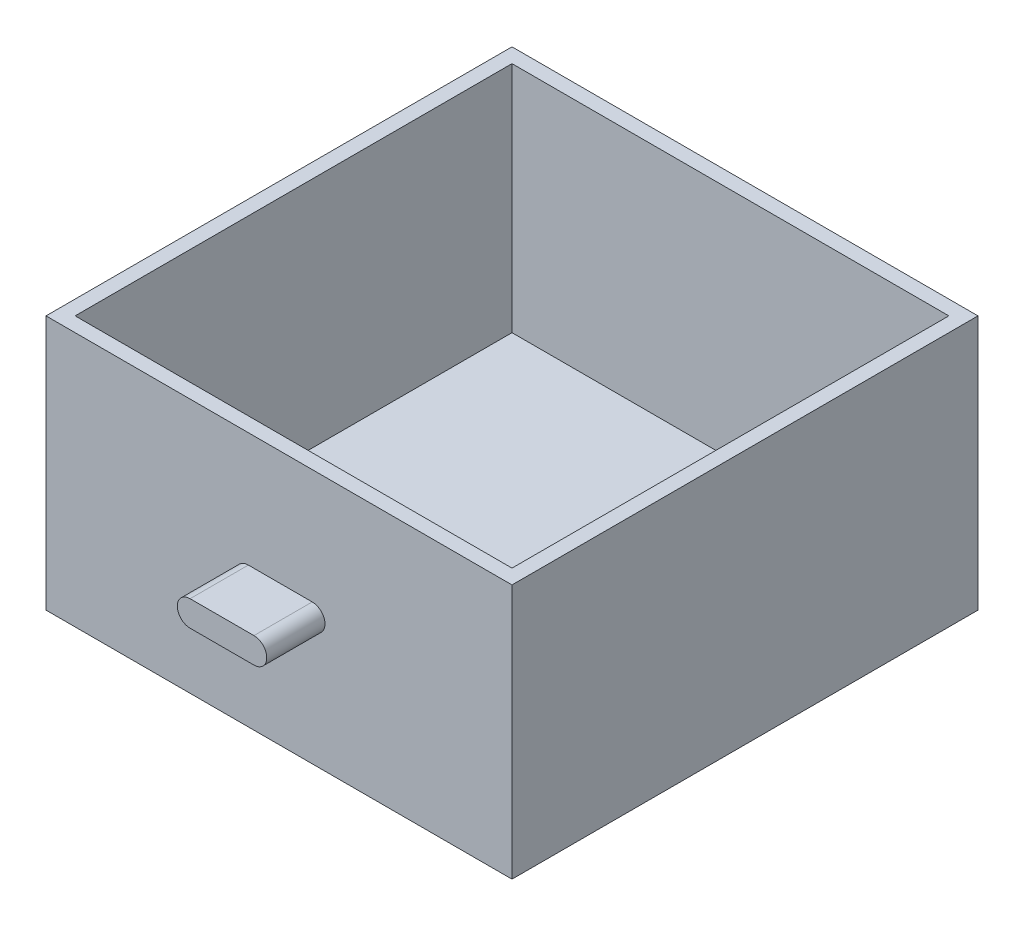
ISO-10303-21;
HEADER;
FILE_DESCRIPTION(('STEP AP214'),'2;1');
FILE_NAME('part.step','',(''),(''),'','','');
FILE_SCHEMA(('AUTOMOTIVE_DESIGN { 1 0 10303 214 1 1 1 1 }'));
ENDSEC;
DATA;
#1=APPLICATION_CONTEXT('core data for automotive mechanical design processes');
#2=APPLICATION_PROTOCOL_DEFINITION('international standard','automotive_design',2000,#1);
#3=PRODUCT_CONTEXT('',#1,'mechanical');
#4=PRODUCT('Part','Part','',(#3));
#5=PRODUCT_RELATED_PRODUCT_CATEGORY('part','',(#4));
#6=PRODUCT_DEFINITION_FORMATION('','',#4);
#7=PRODUCT_DEFINITION_CONTEXT('part definition',#1,'design');
#8=PRODUCT_DEFINITION('design','',#6,#7);
#9=PRODUCT_DEFINITION_SHAPE('','',#8);
#10=(LENGTH_UNIT() NAMED_UNIT(*) SI_UNIT(.MILLI.,.METRE.));
#11=(NAMED_UNIT(*) PLANE_ANGLE_UNIT() SI_UNIT($,.RADIAN.));
#12=(NAMED_UNIT(*) SI_UNIT($,.STERADIAN.) SOLID_ANGLE_UNIT());
#13=UNCERTAINTY_MEASURE_WITH_UNIT(LENGTH_MEASURE(1.E-05),#10,'distance_accuracy_value','');
#14=(GEOMETRIC_REPRESENTATION_CONTEXT(3) GLOBAL_UNCERTAINTY_ASSIGNED_CONTEXT((#13)) GLOBAL_UNIT_ASSIGNED_CONTEXT((#10,
#11,#12)) REPRESENTATION_CONTEXT('',''));
#15=CARTESIAN_POINT('',(0.,0.,0.));
#16=DIRECTION('',(0.,0.,1.));
#17=DIRECTION('',(1.,0.,0.));
#18=AXIS2_PLACEMENT_3D('',#15,#16,#17);
#19=CARTESIAN_POINT('',(32.,35.,32.));
#20=DIRECTION('',(0.,0.,-1.));
#21=DIRECTION('',(-1.,0.,0.));
#22=AXIS2_PLACEMENT_3D('',#19,#20,#21);
#23=PLANE('',#22);
#24=DIRECTION('',(1.,0.,0.));
#25=VECTOR('',#24,1.);
#26=CARTESIAN_POINT('',(32.,0.,32.));
#27=LINE('',#26,#25);
#28=CARTESIAN_POINT('',(-32.,0.,32.));
#29=VERTEX_POINT('',#28);
#30=CARTESIAN_POINT('',(32.,0.,32.));
#31=VERTEX_POINT('',#30);
#32=EDGE_CURVE('E210',#29,#31,#27,.T.);
#33=ORIENTED_EDGE('',*,*,#32,.T.);
#34=DIRECTION('',(0.,-1.,0.));
#35=VECTOR('',#34,1.);
#36=CARTESIAN_POINT('',(32.,35.,32.));
#37=LINE('',#36,#35);
#38=CARTESIAN_POINT('',(32.,35.,32.));
#39=VERTEX_POINT('',#38);
#40=EDGE_CURVE('E221',#39,#31,#37,.T.);
#41=ORIENTED_EDGE('',*,*,#40,.F.);
#42=DIRECTION('',(1.,0.,0.));
#43=VECTOR('',#42,1.);
#44=CARTESIAN_POINT('',(32.,35.,32.));
#45=LINE('',#44,#43);
#46=CARTESIAN_POINT('',(-32.,35.,32.));
#47=VERTEX_POINT('',#46);
#48=EDGE_CURVE('E200',#47,#39,#45,.T.);
#49=ORIENTED_EDGE('',*,*,#48,.F.);
#50=DIRECTION('',(0.,-1.,0.));
#51=VECTOR('',#50,1.);
#52=CARTESIAN_POINT('',(-32.,35.,32.));
#53=LINE('',#52,#51);
#54=EDGE_CURVE('E225',#47,#29,#53,.T.);
#55=ORIENTED_EDGE('',*,*,#54,.T.);
#56=EDGE_LOOP('',(#33,#41,#49,#55));
#57=FACE_BOUND('',#56,.T.);
#58=CARTESIAN_POINT('',(-4.21068038271806,17.5,32.));
#59=DIRECTION('',(0.,0.,1.));
#60=DIRECTION('',(1.,0.,0.));
#61=AXIS2_PLACEMENT_3D('',#58,#59,#60);
#62=CIRCLE('',#61,1.75508770289724);
#63=CARTESIAN_POINT('',(-4.21068038271806,19.2550877028972,32.));
#64=VERTEX_POINT('',#63);
#65=CARTESIAN_POINT('',(-4.21068038271806,15.7449122971028,32.));
#66=VERTEX_POINT('',#65);
#67=EDGE_CURVE('E155',#64,#66,#62,.T.);
#68=ORIENTED_EDGE('',*,*,#67,.F.);
#69=DIRECTION('',(-1.,0.,0.));
#70=VECTOR('',#69,1.);
#71=CARTESIAN_POINT('',(-4.21068038271806,19.2550877028972,32.));
#72=LINE('',#71,#70);
#73=CARTESIAN_POINT('',(4.56197029555858,19.2550877028972,32.));
#74=VERTEX_POINT('',#73);
#75=EDGE_CURVE('E152',#74,#64,#72,.T.);
#76=ORIENTED_EDGE('',*,*,#75,.F.);
#77=CARTESIAN_POINT('',(4.56197029555858,17.5,32.));
#78=DIRECTION('',(0.,0.,1.));
#79=DIRECTION('',(1.,0.,0.));
#80=AXIS2_PLACEMENT_3D('',#77,#78,#79);
#81=CIRCLE('',#80,1.75508770289724);
#82=CARTESIAN_POINT('',(4.56197029555858,15.7449122971028,32.));
#83=VERTEX_POINT('',#82);
#84=EDGE_CURVE('E64',#83,#74,#81,.T.);
#85=ORIENTED_EDGE('',*,*,#84,.F.);
#86=DIRECTION('',(1.,0.,0.));
#87=VECTOR('',#86,1.);
#88=CARTESIAN_POINT('',(-4.21068038271806,15.7449122971028,32.));
#89=LINE('',#88,#87);
#90=EDGE_CURVE('E59',#66,#83,#89,.T.);
#91=ORIENTED_EDGE('',*,*,#90,.F.);
#92=EDGE_LOOP('',(#68,#76,#85,#91));
#93=FACE_BOUND('',#92,.T.);
#94=ADVANCED_FACE('F43',(#57,#93),#23,.F.);
#95=CARTESIAN_POINT('',(0.,3.,0.));
#96=DIRECTION('',(0.,1.,0.));
#97=DIRECTION('',(0.,0.,1.));
#98=AXIS2_PLACEMENT_3D('',#95,#96,#97);
#99=PLANE('',#98);
#100=DIRECTION('',(0.,0.,-1.));
#101=VECTOR('',#100,1.);
#102=CARTESIAN_POINT('',(30.,3.,-30.));
#103=LINE('',#102,#101);
#104=CARTESIAN_POINT('',(30.,3.,30.));
#105=VERTEX_POINT('',#104);
#106=CARTESIAN_POINT('',(30.,3.,-30.));
#107=VERTEX_POINT('',#106);
#108=EDGE_CURVE('E233',#105,#107,#103,.T.);
#109=ORIENTED_EDGE('',*,*,#108,.T.);
#110=DIRECTION('',(-1.,0.,0.));
#111=VECTOR('',#110,1.);
#112=CARTESIAN_POINT('',(-30.,3.,-30.));
#113=LINE('',#112,#111);
#114=CARTESIAN_POINT('',(-30.,3.,-30.));
#115=VERTEX_POINT('',#114);
#116=EDGE_CURVE('E237',#107,#115,#113,.T.);
#117=ORIENTED_EDGE('',*,*,#116,.T.);
#118=DIRECTION('',(0.,0.,1.));
#119=VECTOR('',#118,1.);
#120=CARTESIAN_POINT('',(-30.,3.,-30.));
#121=LINE('',#120,#119);
#122=CARTESIAN_POINT('',(-30.,3.,30.));
#123=VERTEX_POINT('',#122);
#124=EDGE_CURVE('E52',#115,#123,#121,.T.);
#125=ORIENTED_EDGE('',*,*,#124,.T.);
#126=DIRECTION('',(1.,0.,0.));
#127=VECTOR('',#126,1.);
#128=CARTESIAN_POINT('',(-30.,3.,30.));
#129=LINE('',#128,#127);
#130=EDGE_CURVE('E11',#123,#105,#129,.T.);
#131=ORIENTED_EDGE('',*,*,#130,.T.);
#132=EDGE_LOOP('',(#109,#117,#125,#131));
#133=FACE_BOUND('',#132,.T.);
#134=ADVANCED_FACE('F243',(#133),#99,.T.);
#135=CARTESIAN_POINT('',(0.,35.,0.));
#136=DIRECTION('',(0.,-1.,0.));
#137=DIRECTION('',(0.,0.,-1.));
#138=AXIS2_PLACEMENT_3D('',#135,#136,#137);
#139=PLANE('',#138);
#140=DIRECTION('',(-1.,0.,0.));
#141=VECTOR('',#140,1.);
#142=CARTESIAN_POINT('',(-32.,35.,-32.));
#143=LINE('',#142,#141);
#144=CARTESIAN_POINT('',(32.,35.,-32.));
#145=VERTEX_POINT('',#144);
#146=CARTESIAN_POINT('',(-32.,35.,-32.));
#147=VERTEX_POINT('',#146);
#148=EDGE_CURVE('E192',#145,#147,#143,.T.);
#149=ORIENTED_EDGE('',*,*,#148,.T.);
#150=DIRECTION('',(0.,0.,1.));
#151=VECTOR('',#150,1.);
#152=CARTESIAN_POINT('',(-32.,35.,32.));
#153=LINE('',#152,#151);
#154=EDGE_CURVE('E196',#147,#47,#153,.T.);
#155=ORIENTED_EDGE('',*,*,#154,.T.);
#156=ORIENTED_EDGE('',*,*,#48,.T.);
#157=DIRECTION('',(0.,0.,-1.));
#158=VECTOR('',#157,1.);
#159=CARTESIAN_POINT('',(32.,35.,-32.));
#160=LINE('',#159,#158);
#161=EDGE_CURVE('E203',#39,#145,#160,.T.);
#162=ORIENTED_EDGE('',*,*,#161,.T.);
#163=EDGE_LOOP('',(#149,#155,#156,#162));
#164=FACE_BOUND('',#163,.T.);
#165=DIRECTION('',(0.,0.,-1.));
#166=VECTOR('',#165,1.);
#167=CARTESIAN_POINT('',(30.,35.,-30.));
#168=LINE('',#167,#166);
#169=CARTESIAN_POINT('',(30.,35.,30.));
#170=VERTEX_POINT('',#169);
#171=CARTESIAN_POINT('',(30.,35.,-30.));
#172=VERTEX_POINT('',#171);
#173=EDGE_CURVE('E157',#170,#172,#168,.T.);
#174=ORIENTED_EDGE('',*,*,#173,.F.);
#175=DIRECTION('',(1.,0.,0.));
#176=VECTOR('',#175,1.);
#177=CARTESIAN_POINT('',(-30.,35.,30.));
#178=LINE('',#177,#176);
#179=CARTESIAN_POINT('',(-30.,35.,30.));
#180=VERTEX_POINT('',#179);
#181=EDGE_CURVE('E173',#180,#170,#178,.T.);
#182=ORIENTED_EDGE('',*,*,#181,.F.);
#183=DIRECTION('',(0.,0.,1.));
#184=VECTOR('',#183,1.);
#185=CARTESIAN_POINT('',(-30.,35.,-30.));
#186=LINE('',#185,#184);
#187=CARTESIAN_POINT('',(-30.,35.,-30.));
#188=VERTEX_POINT('',#187);
#189=EDGE_CURVE('E169',#188,#180,#186,.T.);
#190=ORIENTED_EDGE('',*,*,#189,.F.);
#191=DIRECTION('',(-1.,0.,0.));
#192=VECTOR('',#191,1.);
#193=CARTESIAN_POINT('',(-30.,35.,-30.));
#194=LINE('',#193,#192);
#195=EDGE_CURVE('E161',#172,#188,#194,.T.);
#196=ORIENTED_EDGE('',*,*,#195,.F.);
#197=EDGE_LOOP('',(#174,#182,#190,#196));
#198=FACE_BOUND('',#197,.T.);
#199=ADVANCED_FACE('F254',(#164,#198),#139,.F.);
#200=CARTESIAN_POINT('',(-32.,35.,32.));
#201=DIRECTION('',(1.,0.,0.));
#202=DIRECTION('',(0.,0.,-1.));
#203=AXIS2_PLACEMENT_3D('',#200,#201,#202);
#204=PLANE('',#203);
#205=DIRECTION('',(0.,0.,1.));
#206=VECTOR('',#205,1.);
#207=CARTESIAN_POINT('',(-32.,0.,32.));
#208=LINE('',#207,#206);
#209=CARTESIAN_POINT('',(-32.,0.,-32.));
#210=VERTEX_POINT('',#209);
#211=EDGE_CURVE('E191',#210,#29,#208,.T.);
#212=ORIENTED_EDGE('',*,*,#211,.T.);
#213=ORIENTED_EDGE('',*,*,#54,.F.);
#214=ORIENTED_EDGE('',*,*,#154,.F.);
#215=DIRECTION('',(0.,-1.,0.));
#216=VECTOR('',#215,1.);
#217=CARTESIAN_POINT('',(-32.,35.,-32.));
#218=LINE('',#217,#216);
#219=EDGE_CURVE('E229',#147,#210,#218,.T.);
#220=ORIENTED_EDGE('',*,*,#219,.T.);
#221=EDGE_LOOP('',(#212,#213,#214,#220));
#222=FACE_BOUND('',#221,.T.);
#223=ADVANCED_FACE('F282',(#222),#204,.F.);
#224=CARTESIAN_POINT('',(32.,35.,-32.));
#225=DIRECTION('',(-1.,0.,0.));
#226=DIRECTION('',(0.,0.,1.));
#227=AXIS2_PLACEMENT_3D('',#224,#225,#226);
#228=PLANE('',#227);
#229=DIRECTION('',(0.,0.,-1.));
#230=VECTOR('',#229,1.);
#231=CARTESIAN_POINT('',(32.,0.,-32.));
#232=LINE('',#231,#230);
#233=CARTESIAN_POINT('',(32.,0.,-32.));
#234=VERTEX_POINT('',#233);
#235=EDGE_CURVE('E213',#31,#234,#232,.T.);
#236=ORIENTED_EDGE('',*,*,#235,.T.);
#237=DIRECTION('',(0.,-1.,0.));
#238=VECTOR('',#237,1.);
#239=CARTESIAN_POINT('',(32.,35.,-32.));
#240=LINE('',#239,#238);
#241=EDGE_CURVE('E207',#145,#234,#240,.T.);
#242=ORIENTED_EDGE('',*,*,#241,.F.);
#243=ORIENTED_EDGE('',*,*,#161,.F.);
#244=ORIENTED_EDGE('',*,*,#40,.T.);
#245=EDGE_LOOP('',(#236,#242,#243,#244));
#246=FACE_BOUND('',#245,.T.);
#247=ADVANCED_FACE('F270',(#246),#228,.F.);
#248=CARTESIAN_POINT('',(-30.,35.,-32.));
#249=DIRECTION('',(0.,0.,1.));
#250=DIRECTION('',(1.,0.,0.));
#251=AXIS2_PLACEMENT_3D('',#248,#249,#250);
#252=PLANE('',#251);
#253=DIRECTION('',(-1.,0.,0.));
#254=VECTOR('',#253,1.);
#255=CARTESIAN_POINT('',(-30.,0.,-32.));
#256=LINE('',#255,#254);
#257=EDGE_CURVE('E197',#234,#210,#256,.T.);
#258=ORIENTED_EDGE('',*,*,#257,.T.);
#259=ORIENTED_EDGE('',*,*,#219,.F.);
#260=ORIENTED_EDGE('',*,*,#148,.F.);
#261=ORIENTED_EDGE('',*,*,#241,.T.);
#262=EDGE_LOOP('',(#258,#259,#260,#261));
#263=FACE_BOUND('',#262,.T.);
#264=ADVANCED_FACE('F263',(#263),#252,.F.);
#265=CARTESIAN_POINT('',(30.,35.,-30.));
#266=DIRECTION('',(-1.,0.,0.));
#267=DIRECTION('',(0.,0.,1.));
#268=AXIS2_PLACEMENT_3D('',#265,#266,#267);
#269=PLANE('',#268);
#270=DIRECTION('',(0.,-1.,0.));
#271=VECTOR('',#270,1.);
#272=CARTESIAN_POINT('',(30.,35.,-30.));
#273=LINE('',#272,#271);
#274=EDGE_CURVE('E187',#172,#107,#273,.T.);
#275=ORIENTED_EDGE('',*,*,#274,.T.);
#276=ORIENTED_EDGE('',*,*,#108,.F.);
#277=DIRECTION('',(0.,-1.,0.));
#278=VECTOR('',#277,1.);
#279=CARTESIAN_POINT('',(30.,35.,30.));
#280=LINE('',#279,#278);
#281=EDGE_CURVE('E176',#170,#105,#280,.T.);
#282=ORIENTED_EDGE('',*,*,#281,.F.);
#283=ORIENTED_EDGE('',*,*,#173,.T.);
#284=EDGE_LOOP('',(#275,#276,#282,#283));
#285=FACE_BOUND('',#284,.T.);
#286=ADVANCED_FACE('F261',(#285),#269,.T.);
#287=CARTESIAN_POINT('',(-30.,35.,-30.));
#288=DIRECTION('',(0.,0.,1.));
#289=DIRECTION('',(1.,0.,0.));
#290=AXIS2_PLACEMENT_3D('',#287,#288,#289);
#291=PLANE('',#290);
#292=DIRECTION('',(0.,-1.,0.));
#293=VECTOR('',#292,1.);
#294=CARTESIAN_POINT('',(-30.,35.,-30.));
#295=LINE('',#294,#293);
#296=EDGE_CURVE('E183',#188,#115,#295,.T.);
#297=ORIENTED_EDGE('',*,*,#296,.T.);
#298=ORIENTED_EDGE('',*,*,#116,.F.);
#299=ORIENTED_EDGE('',*,*,#274,.F.);
#300=ORIENTED_EDGE('',*,*,#195,.T.);
#301=EDGE_LOOP('',(#297,#298,#299,#300));
#302=FACE_BOUND('',#301,.T.);
#303=ADVANCED_FACE('F249',(#302),#291,.T.);
#304=CARTESIAN_POINT('',(-30.,35.,-30.));
#305=DIRECTION('',(1.,0.,0.));
#306=DIRECTION('',(0.,0.,-1.));
#307=AXIS2_PLACEMENT_3D('',#304,#305,#306);
#308=PLANE('',#307);
#309=DIRECTION('',(0.,-1.,0.));
#310=VECTOR('',#309,1.);
#311=CARTESIAN_POINT('',(-30.,35.,30.));
#312=LINE('',#311,#310);
#313=EDGE_CURVE('E179',#180,#123,#312,.T.);
#314=ORIENTED_EDGE('',*,*,#313,.T.);
#315=ORIENTED_EDGE('',*,*,#124,.F.);
#316=ORIENTED_EDGE('',*,*,#296,.F.);
#317=ORIENTED_EDGE('',*,*,#189,.T.);
#318=EDGE_LOOP('',(#314,#315,#316,#317));
#319=FACE_BOUND('',#318,.T.);
#320=ADVANCED_FACE('F246',(#319),#308,.T.);
#321=CARTESIAN_POINT('',(-30.,35.,30.));
#322=DIRECTION('',(0.,0.,-1.));
#323=DIRECTION('',(-1.,0.,0.));
#324=AXIS2_PLACEMENT_3D('',#321,#322,#323);
#325=PLANE('',#324);
#326=ORIENTED_EDGE('',*,*,#281,.T.);
#327=ORIENTED_EDGE('',*,*,#130,.F.);
#328=ORIENTED_EDGE('',*,*,#313,.F.);
#329=ORIENTED_EDGE('',*,*,#181,.T.);
#330=EDGE_LOOP('',(#326,#327,#328,#329));
#331=FACE_BOUND('',#330,.T.);
#332=ADVANCED_FACE('F258',(#331),#325,.T.);
#333=CARTESIAN_POINT('',(0.,0.,0.));
#334=DIRECTION('',(0.,1.,0.));
#335=DIRECTION('',(0.,0.,1.));
#336=AXIS2_PLACEMENT_3D('',#333,#334,#335);
#337=PLANE('',#336);
#338=ORIENTED_EDGE('',*,*,#211,.F.);
#339=ORIENTED_EDGE('',*,*,#257,.F.);
#340=ORIENTED_EDGE('',*,*,#235,.F.);
#341=ORIENTED_EDGE('',*,*,#32,.F.);
#342=EDGE_LOOP('',(#338,#339,#340,#341));
#343=FACE_BOUND('',#342,.T.);
#344=ADVANCED_FACE('F45',(#343),#337,.F.);
#345=CARTESIAN_POINT('',(-4.21068038271806,17.5,40.));
#346=DIRECTION('',(0.,0.,-1.));
#347=DIRECTION('',(-1.,0.,0.));
#348=AXIS2_PLACEMENT_3D('',#345,#346,#347);
#349=CYLINDRICAL_SURFACE('',#348,1.75508770289724);
#350=ORIENTED_EDGE('',*,*,#67,.T.);
#351=DIRECTION('',(0.,0.,-1.));
#352=VECTOR('',#351,1.);
#353=CARTESIAN_POINT('',(-4.21068038271806,15.7449122971028,40.));
#354=LINE('',#353,#352);
#355=CARTESIAN_POINT('',(-4.21068038271806,15.7449122971028,40.));
#356=VERTEX_POINT('',#355);
#357=EDGE_CURVE('E134',#356,#66,#354,.T.);
#358=ORIENTED_EDGE('',*,*,#357,.F.);
#359=CARTESIAN_POINT('',(-4.21068038271806,17.5,40.));
#360=DIRECTION('',(0.,0.,1.));
#361=DIRECTION('',(1.,0.,0.));
#362=AXIS2_PLACEMENT_3D('',#359,#360,#361);
#363=CIRCLE('',#362,1.75508770289724);
#364=CARTESIAN_POINT('',(-4.21068038271806,19.2550877028972,40.));
#365=VERTEX_POINT('',#364);
#366=EDGE_CURVE('E142',#365,#356,#363,.T.);
#367=ORIENTED_EDGE('',*,*,#366,.F.);
#368=DIRECTION('',(0.,0.,-1.));
#369=VECTOR('',#368,1.);
#370=CARTESIAN_POINT('',(-4.21068038271806,19.2550877028972,40.));
#371=LINE('',#370,#369);
#372=EDGE_CURVE('E451',#365,#64,#371,.T.);
#373=ORIENTED_EDGE('',*,*,#372,.T.);
#374=EDGE_LOOP('',(#350,#358,#367,#373));
#375=FACE_BOUND('',#374,.T.);
#376=ADVANCED_FACE('F154',(#375),#349,.T.);
#377=CARTESIAN_POINT('',(-4.21068038271806,15.7449122971028,40.));
#378=DIRECTION('',(0.,1.,0.));
#379=DIRECTION('',(0.,0.,1.));
#380=AXIS2_PLACEMENT_3D('',#377,#378,#379);
#381=PLANE('',#380);
#382=ORIENTED_EDGE('',*,*,#90,.T.);
#383=DIRECTION('',(0.,0.,-1.));
#384=VECTOR('',#383,1.);
#385=CARTESIAN_POINT('',(4.56197029555858,15.7449122971028,40.));
#386=LINE('',#385,#384);
#387=CARTESIAN_POINT('',(4.56197029555858,15.7449122971028,40.));
#388=VERTEX_POINT('',#387);
#389=EDGE_CURVE('E137',#388,#83,#386,.T.);
#390=ORIENTED_EDGE('',*,*,#389,.F.);
#391=DIRECTION('',(1.,0.,0.));
#392=VECTOR('',#391,1.);
#393=CARTESIAN_POINT('',(-4.21068038271806,15.7449122971028,40.));
#394=LINE('',#393,#392);
#395=EDGE_CURVE('E130',#356,#388,#394,.T.);
#396=ORIENTED_EDGE('',*,*,#395,.F.);
#397=ORIENTED_EDGE('',*,*,#357,.T.);
#398=EDGE_LOOP('',(#382,#390,#396,#397));
#399=FACE_BOUND('',#398,.T.);
#400=ADVANCED_FACE('F132',(#399),#381,.F.);
#401=CARTESIAN_POINT('',(4.56197029555858,17.5,40.));
#402=DIRECTION('',(0.,0.,-1.));
#403=DIRECTION('',(-1.,0.,0.));
#404=AXIS2_PLACEMENT_3D('',#401,#402,#403);
#405=CYLINDRICAL_SURFACE('',#404,1.75508770289724);
#406=ORIENTED_EDGE('',*,*,#84,.T.);
#407=DIRECTION('',(0.,0.,-1.));
#408=VECTOR('',#407,1.);
#409=CARTESIAN_POINT('',(4.56197029555858,19.2550877028972,40.));
#410=LINE('',#409,#408);
#411=CARTESIAN_POINT('',(4.56197029555858,19.2550877028972,40.));
#412=VERTEX_POINT('',#411);
#413=EDGE_CURVE('E163',#412,#74,#410,.T.);
#414=ORIENTED_EDGE('',*,*,#413,.F.);
#415=CARTESIAN_POINT('',(4.56197029555858,17.5,40.));
#416=DIRECTION('',(0.,0.,1.));
#417=DIRECTION('',(1.,0.,0.));
#418=AXIS2_PLACEMENT_3D('',#415,#416,#417);
#419=CIRCLE('',#418,1.75508770289724);
#420=EDGE_CURVE('E141',#388,#412,#419,.T.);
#421=ORIENTED_EDGE('',*,*,#420,.F.);
#422=ORIENTED_EDGE('',*,*,#389,.T.);
#423=EDGE_LOOP('',(#406,#414,#421,#422));
#424=FACE_BOUND('',#423,.T.);
#425=ADVANCED_FACE('F316',(#424),#405,.T.);
#426=CARTESIAN_POINT('',(-4.21068038271806,19.2550877028972,40.));
#427=DIRECTION('',(0.,-1.,0.));
#428=DIRECTION('',(0.,0.,-1.));
#429=AXIS2_PLACEMENT_3D('',#426,#427,#428);
#430=PLANE('',#429);
#431=ORIENTED_EDGE('',*,*,#75,.T.);
#432=ORIENTED_EDGE('',*,*,#372,.F.);
#433=DIRECTION('',(-1.,0.,0.));
#434=VECTOR('',#433,1.);
#435=CARTESIAN_POINT('',(-4.21068038271806,19.2550877028972,40.));
#436=LINE('',#435,#434);
#437=EDGE_CURVE('E147',#412,#365,#436,.T.);
#438=ORIENTED_EDGE('',*,*,#437,.F.);
#439=ORIENTED_EDGE('',*,*,#413,.T.);
#440=EDGE_LOOP('',(#431,#432,#438,#439));
#441=FACE_BOUND('',#440,.T.);
#442=ADVANCED_FACE('F319',(#441),#430,.F.);
#443=CARTESIAN_POINT('',(-4.21068038271806,17.5,40.));
#444=DIRECTION('',(0.,0.,1.));
#445=DIRECTION('',(1.,0.,0.));
#446=AXIS2_PLACEMENT_3D('',#443,#444,#445);
#447=PLANE('',#446);
#448=ORIENTED_EDGE('',*,*,#366,.T.);
#449=ORIENTED_EDGE('',*,*,#395,.T.);
#450=ORIENTED_EDGE('',*,*,#420,.T.);
#451=ORIENTED_EDGE('',*,*,#437,.T.);
#452=EDGE_LOOP('',(#448,#449,#450,#451));
#453=FACE_BOUND('',#452,.T.);
#454=ADVANCED_FACE('F145',(#453),#447,.T.);
#455=CLOSED_SHELL('',(#94,#134,#199,#223,#247,#264,#286,#303,#320,#332,#344,#376,#400,#425,#442,#454));
#456=MANIFOLD_SOLID_BREP('B2',#455);
#457=ADVANCED_BREP_SHAPE_REPRESENTATION('',(#18,#456),#14);
#458=SHAPE_DEFINITION_REPRESENTATION(#9,#457);
ENDSEC;
END-ISO-10303-21;
